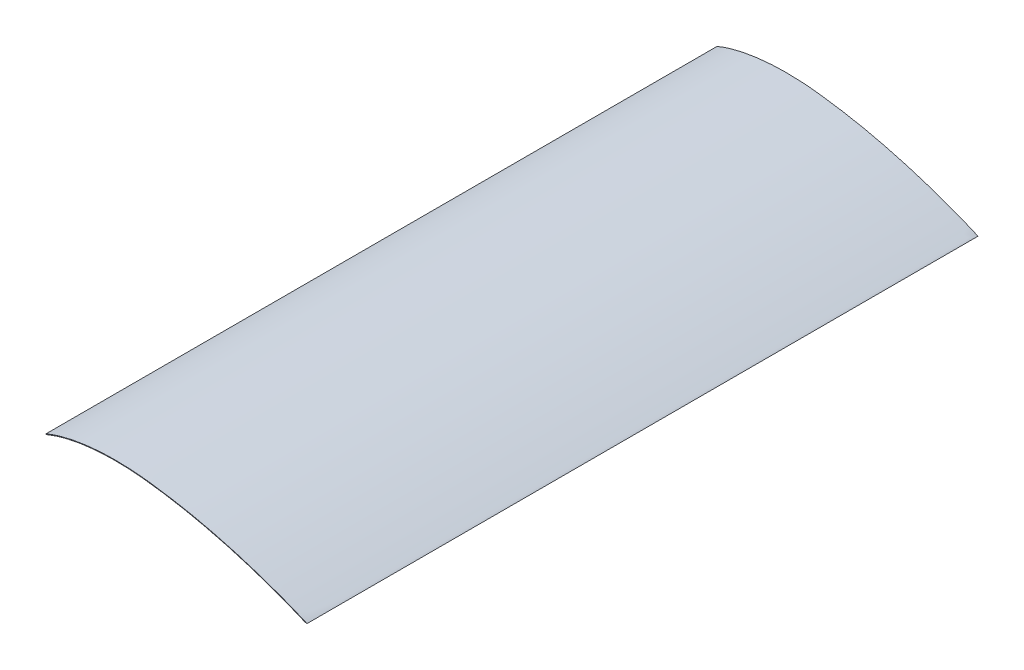
ISO-10303-21;
HEADER;
FILE_DESCRIPTION(('STEP AP214'),'2;1');
FILE_NAME('part.step','',(''),(''),'','','');
FILE_SCHEMA(('AUTOMOTIVE_DESIGN { 1 0 10303 214 1 1 1 1 }'));
ENDSEC;
DATA;
#1=APPLICATION_CONTEXT('core data for automotive mechanical design processes');
#2=APPLICATION_PROTOCOL_DEFINITION('international standard','automotive_design',2000,#1);
#3=PRODUCT_CONTEXT('',#1,'mechanical');
#4=PRODUCT('Part','Part','',(#3));
#5=PRODUCT_RELATED_PRODUCT_CATEGORY('part','',(#4));
#6=PRODUCT_DEFINITION_FORMATION('','',#4);
#7=PRODUCT_DEFINITION_CONTEXT('part definition',#1,'design');
#8=PRODUCT_DEFINITION('design','',#6,#7);
#9=PRODUCT_DEFINITION_SHAPE('','',#8);
#10=(LENGTH_UNIT() NAMED_UNIT(*) SI_UNIT(.MILLI.,.METRE.));
#11=(NAMED_UNIT(*) PLANE_ANGLE_UNIT() SI_UNIT($,.RADIAN.));
#12=(NAMED_UNIT(*) SI_UNIT($,.STERADIAN.) SOLID_ANGLE_UNIT());
#13=UNCERTAINTY_MEASURE_WITH_UNIT(LENGTH_MEASURE(1.E-05),#10,'distance_accuracy_value','');
#14=(GEOMETRIC_REPRESENTATION_CONTEXT(3) GLOBAL_UNCERTAINTY_ASSIGNED_CONTEXT((#13)) GLOBAL_UNIT_ASSIGNED_CONTEXT((#10,
#11,#12)) REPRESENTATION_CONTEXT('',''));
#15=CARTESIAN_POINT('',(0.,0.,0.));
#16=DIRECTION('',(0.,0.,1.));
#17=DIRECTION('',(1.,0.,0.));
#18=AXIS2_PLACEMENT_3D('',#15,#16,#17);
#19=CARTESIAN_POINT('',(2270.77788466961,3159.89663616639,895.35));
#20=CARTESIAN_POINT('',(2270.75441769039,3159.91143855878,895.35));
#21=CARTESIAN_POINT('',(2270.63695656596,3159.96239266981,895.35));
#22=CARTESIAN_POINT('',(2270.36575862843,3160.06926016445,895.35));
#23=CARTESIAN_POINT('',(2269.93906850024,3160.26306640839,895.35));
#24=CARTESIAN_POINT('',(2269.32699403681,3160.50067953595,895.35));
#25=CARTESIAN_POINT('',(2268.57167887371,3160.86200606842,895.35));
#26=CARTESIAN_POINT('',(2267.60940368282,3161.24694817799,895.35));
#27=CARTESIAN_POINT('',(2266.50269764293,3161.75105580007,895.35));
#28=CARTESIAN_POINT('',(2265.19999899403,3162.26377705241,895.35));
#29=CARTESIAN_POINT('',(2263.75825764628,3162.90920339134,895.35));
#30=CARTESIAN_POINT('',(2262.12114844864,3163.56415045029,895.35));
#31=CARTESIAN_POINT('',(2260.33566343513,3164.3301804082,895.35));
#32=CARTESIAN_POINT('',(2258.36407508904,3165.1271879393,895.35));
#33=CARTESIAN_POINT('',(2256.26077350467,3166.03566592802,895.35));
#34=CARTESIAN_POINT('',(2253.96307066851,3166.91249870451,895.35));
#35=CARTESIAN_POINT('',(2251.54387420959,3167.92705758091,895.35));
#36=CARTESIAN_POINT('',(2248.93741357343,3168.93687987265,895.35));
#37=CARTESIAN_POINT('',(2246.1985054601,3170.0895220124,895.35));
#38=CARTESIAN_POINT('',(2243.26627685385,3171.20143110375,895.35));
#39=CARTESIAN_POINT('',(2240.19942848926,3172.37679779784,895.35));
#40=CARTESIAN_POINT('',(2237.00258241217,3173.63067668475,895.35));
#41=CARTESIAN_POINT('',(2233.62513923245,3174.83803358942,895.35));
#42=CARTESIAN_POINT('',(2230.13801904045,3176.1781322585,895.35));
#43=CARTESIAN_POINT('',(2226.50130882034,3177.51113996912,895.35));
#44=CARTESIAN_POINT('',(2222.72308913832,3178.84660029749,895.35));
#45=CARTESIAN_POINT('',(2218.80429741313,3180.23256580446,895.35));
#46=CARTESIAN_POINT('',(2214.76588339932,3181.68446522613,895.35));
#47=CARTESIAN_POINT('',(2210.57362780371,3183.06607239162,895.35));
#48=CARTESIAN_POINT('',(2206.28683514806,3184.54064589503,895.35));
#49=CARTESIAN_POINT('',(2201.86217341549,3185.99073749897,895.35));
#50=CARTESIAN_POINT('',(2197.3190000198,3187.46365163279,895.35));
#51=CARTESIAN_POINT('',(2192.67416270832,3188.93408962667,895.35));
#52=CARTESIAN_POINT('',(2187.9232086531,3190.42759829958,895.35));
#53=CARTESIAN_POINT('',(2183.07356064678,3191.91931943375,895.35));
#54=CARTESIAN_POINT('',(2178.10228087778,3193.37336943061,895.35));
#55=CARTESIAN_POINT('',(2173.05533437455,3194.85114325785,895.35));
#56=CARTESIAN_POINT('',(2167.90821903263,3196.27713073043,895.35));
#57=CARTESIAN_POINT('',(2162.6816005395,3197.72333555087,895.35));
#58=CARTESIAN_POINT('',(2157.38815239052,3199.18447750399,895.35));
#59=CARTESIAN_POINT('',(2151.9869454316,3200.55249360316,895.35));
#60=CARTESIAN_POINT('',(2146.53036986134,3201.92921093909,895.35));
#61=CARTESIAN_POINT('',(2141.02366012594,3203.33994756066,895.35));
#62=CARTESIAN_POINT('',(2135.44750632117,3204.64652814106,895.35));
#63=CARTESIAN_POINT('',(2129.82565461853,3205.93588774425,895.35));
#64=CARTESIAN_POINT('',(2124.13403374766,3207.17561141733,895.35));
#65=CARTESIAN_POINT('',(2118.41784400398,3208.45051225556,895.35));
#66=CARTESIAN_POINT('',(2112.64631541419,3209.61725546409,895.35));
#67=CARTESIAN_POINT('',(2106.85842089775,3210.78690702624,895.35));
#68=CARTESIAN_POINT('',(2101.02628741808,3211.83151467106,895.35));
#69=CARTESIAN_POINT('',(2095.19814673357,3212.93341937269,895.35));
#70=CARTESIAN_POINT('',(2089.34512567525,3213.94163165049,895.35));
#71=CARTESIAN_POINT('',(2083.47919861778,3214.8366070782,895.35));
#72=CARTESIAN_POINT('',(2077.6195211371,3215.81985962215,895.35));
#73=CARTESIAN_POINT('',(2071.74267498587,3216.58384990485,895.35));
#74=CARTESIAN_POINT('',(2065.89798828981,3217.45068756556,895.35));
#75=CARTESIAN_POINT('',(2060.0556024653,3218.12639788215,895.35));
#76=CARTESIAN_POINT('',(2054.21697582898,3218.79916411901,895.35));
#77=CARTESIAN_POINT('',(2048.36498851862,3219.44837693793,895.35));
#78=CARTESIAN_POINT('',(2042.50169237592,3219.96870442143,895.35));
#79=CARTESIAN_POINT('',(2036.65520239213,3220.3646139235,895.35));
#80=CARTESIAN_POINT('',(2030.84198188323,3220.71383907115,895.35));
#81=CARTESIAN_POINT('',(2025.08169778607,3220.91509423003,895.35));
#82=CARTESIAN_POINT('',(2019.37787069975,3221.069638567,895.35));
#83=CARTESIAN_POINT('',(2013.75347819639,3221.0776575298,895.35));
#84=CARTESIAN_POINT('',(2008.18375284768,3221.03353702776,895.35));
#85=CARTESIAN_POINT('',(2002.70721311472,3220.85332481041,895.35));
#86=CARTESIAN_POINT('',(1997.31094032244,3220.59727813217,895.35));
#87=CARTESIAN_POINT('',(1992.00810418627,3220.26082638274,895.35));
#88=CARTESIAN_POINT('',(1986.79786105407,3219.85281768219,895.35));
#89=CARTESIAN_POINT('',(1981.69445283075,3219.35029259485,895.35));
#90=CARTESIAN_POINT('',(1976.70820462213,3218.77364892142,895.35));
#91=CARTESIAN_POINT('',(1971.84426656151,3218.10372937658,895.35));
#92=CARTESIAN_POINT('',(1967.09401103855,3217.40114523239,895.35));
#93=CARTESIAN_POINT('',(1962.47602668157,3216.61531419052,895.35));
#94=CARTESIAN_POINT('',(1957.99501039177,3215.73076672323,895.35));
#95=CARTESIAN_POINT('',(1953.65377870501,3214.81183300925,895.35));
#96=CARTESIAN_POINT('',(1949.45954354017,3213.83847601063,895.35));
#97=CARTESIAN_POINT('',(1945.41779803353,3212.83543872257,895.35));
#98=CARTESIAN_POINT('',(1941.53936577964,3211.73703792526,895.35));
#99=CARTESIAN_POINT('',(1937.7862256577,3210.70181312941,895.35));
#100=CARTESIAN_POINT('',(1934.22427518623,3209.52008651987,895.35));
#101=CARTESIAN_POINT('',(1930.82349313659,3208.33873603158,895.35));
#102=CARTESIAN_POINT('',(1927.57746088316,3207.17536130258,895.35));
#103=CARTESIAN_POINT('',(1924.83244703152,3206.04244597766,895.35));
#104=CARTESIAN_POINT('',(1923.15176930588,3205.34816556829,895.35));
#105=CARTESIAN_POINT('',(1922.49105513807,3205.0669475751,895.35));
#106=B_SPLINE_CURVE_WITH_KNOTS('',3,(#19,#20,#21,#22,#23,#24,#25,#26,#27,#28,#29,#30,#31,#32,
#33,#34,#35,#36,#37,#38,#39,#40,#41,#42,#43,#44,#45,#46,#47,#48,#49,#50,#51,#52,#53,#54,#55,#56,
#57,#58,#59,#60,#61,#62,#63,#64,#65,#66,#67,#68,#69,#70,#71,#72,#73,#74,#75,#76,#77,#78,#79,#80,
#81,#82,#83,#84,#85,#86,#87,#88,#89,#90,#91,#92,#93,#94,#95,#96,#97,#98,#99,#100,#101,#102,#103,
#104,#105),.UNSPECIFIED.,.F.,.F.,(4,1,1,1,1,1,1,1,1,1,1,1,1,1,1,1,1,1,1,1,1,1,1,1,1,1,1,1,1,1,1,
1,1,1,1,1,1,1,1,1,1,1,1,1,1,1,1,1,1,1,1,1,1,1,1,1,1,1,1,1,1,1,1,1,1,1,1,1,1,1,1,1,1,1,1,1,1,1,1,
1,1,1,1,1,4),(0.,0.0032646592471837,0.01530412767345,0.0342841276747175,0.0587581874108095,
0.0929359111498455,0.133105815307578,0.181130717181506,0.236533821787717,0.298407512480774,
0.367661393238582,0.444765429448946,0.527870086358271,0.618824688221263,0.715328368980061,
0.818286840218887,0.928640049506335,1.04544917415071,1.16921377975364,1.29898963112746,
1.43338102519745,1.57476753374715,1.72258126788615,1.87459664737088,2.03222932545561,
2.19587963068012,2.36554771253332,2.53906673166404,2.71719271516992,2.90097302423531,
3.08900152632988,3.28128413604827,3.47640591238317,3.67721297699968,3.88054648038743,
4.08815930176434,4.29832831755882,4.51135827789291,4.72868260050798,4.94689277625484,
5.16941229539971,5.39336887154832,5.61827048648152,5.84582449589453,6.07460234971807,
6.3062689739868,6.53753039316444,6.77005115008798,7.0036739614743,7.23729677285972,
7.47060915830041,7.70510170317167,7.93813983996393,8.1722912516621,8.40498612311402,
8.63596163004119,8.86686791146174,9.09917313568284,9.33135445276082,9.5620344527604,
9.79127305073218,10.0191500078822,10.2427636765157,10.4651634211198,10.6834077841633,
10.9005947460189,11.1122947460183,11.3214623582344,11.528149067048,11.7295285347202,
11.9271092078636,12.1209596048197,12.3094070935271,12.4942513966581,12.6741634473933,
12.8488394972688,13.0183316009194,13.1826967383429,13.340619884207,13.4944196410342,
13.6424495299088,13.7837380078534,13.919674906449,14.0496149064496,14.1344292083141),.UNSPECIFIED.);
#107=DIRECTION('',(0.,0.,-1.));
#108=VECTOR('',#107,1.);
#109=SURFACE_OF_LINEAR_EXTRUSION('',#106,#108);
#110=CARTESIAN_POINT('',(2270.77788466961,3159.89663616639,0.));
#111=CARTESIAN_POINT('',(2270.75441769039,3159.91143855878,0.));
#112=CARTESIAN_POINT('',(2270.63695656596,3159.96239266981,0.));
#113=CARTESIAN_POINT('',(2270.36575862843,3160.06926016445,0.));
#114=CARTESIAN_POINT('',(2269.93906850024,3160.26306640839,0.));
#115=CARTESIAN_POINT('',(2269.32699403681,3160.50067953595,0.));
#116=CARTESIAN_POINT('',(2268.57167887371,3160.86200606842,0.));
#117=CARTESIAN_POINT('',(2267.60940368282,3161.24694817799,0.));
#118=CARTESIAN_POINT('',(2266.50269764293,3161.75105580007,0.));
#119=CARTESIAN_POINT('',(2265.19999899403,3162.26377705241,0.));
#120=CARTESIAN_POINT('',(2263.75825764628,3162.90920339134,0.));
#121=CARTESIAN_POINT('',(2262.12114844864,3163.56415045029,0.));
#122=CARTESIAN_POINT('',(2260.33566343513,3164.3301804082,0.));
#123=CARTESIAN_POINT('',(2258.36407508904,3165.1271879393,0.));
#124=CARTESIAN_POINT('',(2256.26077350467,3166.03566592802,0.));
#125=CARTESIAN_POINT('',(2253.96307066851,3166.91249870451,0.));
#126=CARTESIAN_POINT('',(2251.54387420959,3167.92705758091,0.));
#127=CARTESIAN_POINT('',(2248.93741357343,3168.93687987265,0.));
#128=CARTESIAN_POINT('',(2246.1985054601,3170.0895220124,0.));
#129=CARTESIAN_POINT('',(2243.26627685385,3171.20143110375,0.));
#130=CARTESIAN_POINT('',(2240.19942848926,3172.37679779784,0.));
#131=CARTESIAN_POINT('',(2237.00258241217,3173.63067668475,0.));
#132=CARTESIAN_POINT('',(2233.62513923245,3174.83803358942,0.));
#133=CARTESIAN_POINT('',(2230.13801904045,3176.1781322585,0.));
#134=CARTESIAN_POINT('',(2226.50130882034,3177.51113996912,0.));
#135=CARTESIAN_POINT('',(2222.72308913832,3178.84660029749,0.));
#136=CARTESIAN_POINT('',(2218.80429741313,3180.23256580446,0.));
#137=CARTESIAN_POINT('',(2214.76588339932,3181.68446522613,0.));
#138=CARTESIAN_POINT('',(2210.57362780371,3183.06607239162,0.));
#139=CARTESIAN_POINT('',(2206.28683514806,3184.54064589503,0.));
#140=CARTESIAN_POINT('',(2201.86217341549,3185.99073749897,0.));
#141=CARTESIAN_POINT('',(2197.3190000198,3187.46365163279,0.));
#142=CARTESIAN_POINT('',(2192.67416270832,3188.93408962667,0.));
#143=CARTESIAN_POINT('',(2187.9232086531,3190.42759829958,0.));
#144=CARTESIAN_POINT('',(2183.07356064678,3191.91931943375,0.));
#145=CARTESIAN_POINT('',(2178.10228087778,3193.37336943061,0.));
#146=CARTESIAN_POINT('',(2173.05533437455,3194.85114325785,0.));
#147=CARTESIAN_POINT('',(2167.90821903263,3196.27713073043,0.));
#148=CARTESIAN_POINT('',(2162.6816005395,3197.72333555087,0.));
#149=CARTESIAN_POINT('',(2157.38815239052,3199.18447750399,0.));
#150=CARTESIAN_POINT('',(2151.9869454316,3200.55249360316,0.));
#151=CARTESIAN_POINT('',(2146.53036986134,3201.92921093909,0.));
#152=CARTESIAN_POINT('',(2141.02366012594,3203.33994756066,0.));
#153=CARTESIAN_POINT('',(2135.44750632117,3204.64652814106,0.));
#154=CARTESIAN_POINT('',(2129.82565461853,3205.93588774425,0.));
#155=CARTESIAN_POINT('',(2124.13403374766,3207.17561141733,0.));
#156=CARTESIAN_POINT('',(2118.41784400398,3208.45051225556,0.));
#157=CARTESIAN_POINT('',(2112.64631541419,3209.61725546409,0.));
#158=CARTESIAN_POINT('',(2106.85842089775,3210.78690702624,0.));
#159=CARTESIAN_POINT('',(2101.02628741808,3211.83151467106,0.));
#160=CARTESIAN_POINT('',(2095.19814673357,3212.93341937269,0.));
#161=CARTESIAN_POINT('',(2089.34512567525,3213.94163165049,0.));
#162=CARTESIAN_POINT('',(2083.47919861778,3214.8366070782,0.));
#163=CARTESIAN_POINT('',(2077.6195211371,3215.81985962215,0.));
#164=CARTESIAN_POINT('',(2071.74267498587,3216.58384990485,0.));
#165=CARTESIAN_POINT('',(2065.89798828981,3217.45068756556,0.));
#166=CARTESIAN_POINT('',(2060.0556024653,3218.12639788215,0.));
#167=CARTESIAN_POINT('',(2054.21697582898,3218.79916411901,0.));
#168=CARTESIAN_POINT('',(2048.36498851862,3219.44837693793,0.));
#169=CARTESIAN_POINT('',(2042.50169237592,3219.96870442143,0.));
#170=CARTESIAN_POINT('',(2036.65520239213,3220.3646139235,0.));
#171=CARTESIAN_POINT('',(2030.84198188323,3220.71383907115,0.));
#172=CARTESIAN_POINT('',(2025.08169778607,3220.91509423003,0.));
#173=CARTESIAN_POINT('',(2019.37787069975,3221.069638567,0.));
#174=CARTESIAN_POINT('',(2013.75347819639,3221.0776575298,0.));
#175=CARTESIAN_POINT('',(2008.18375284768,3221.03353702776,0.));
#176=CARTESIAN_POINT('',(2002.70721311472,3220.85332481041,0.));
#177=CARTESIAN_POINT('',(1997.31094032244,3220.59727813217,0.));
#178=CARTESIAN_POINT('',(1992.00810418627,3220.26082638274,0.));
#179=CARTESIAN_POINT('',(1986.79786105407,3219.85281768219,0.));
#180=CARTESIAN_POINT('',(1981.69445283075,3219.35029259485,0.));
#181=CARTESIAN_POINT('',(1976.70820462213,3218.77364892142,0.));
#182=CARTESIAN_POINT('',(1971.84426656151,3218.10372937658,0.));
#183=CARTESIAN_POINT('',(1967.09401103855,3217.40114523239,0.));
#184=CARTESIAN_POINT('',(1962.47602668157,3216.61531419052,0.));
#185=CARTESIAN_POINT('',(1957.99501039177,3215.73076672323,0.));
#186=CARTESIAN_POINT('',(1953.65377870501,3214.81183300925,0.));
#187=CARTESIAN_POINT('',(1949.45954354017,3213.83847601063,0.));
#188=CARTESIAN_POINT('',(1945.41779803353,3212.83543872257,0.));
#189=CARTESIAN_POINT('',(1941.53936577964,3211.73703792526,0.));
#190=CARTESIAN_POINT('',(1937.7862256577,3210.70181312941,0.));
#191=CARTESIAN_POINT('',(1934.22427518623,3209.52008651987,0.));
#192=CARTESIAN_POINT('',(1930.82349313659,3208.33873603158,0.));
#193=CARTESIAN_POINT('',(1927.57746088316,3207.17536130258,0.));
#194=CARTESIAN_POINT('',(1924.83244703152,3206.04244597766,0.));
#195=CARTESIAN_POINT('',(1923.15176930588,3205.34816556829,0.));
#196=CARTESIAN_POINT('',(1922.49105513807,3205.0669475751,0.));
#197=B_SPLINE_CURVE_WITH_KNOTS('',3,(#110,#111,#112,#113,#114,#115,#116,#117,#118,#119,#120,
#121,#122,#123,#124,#125,#126,#127,#128,#129,#130,#131,#132,#133,#134,#135,#136,#137,#138,#139,
#140,#141,#142,#143,#144,#145,#146,#147,#148,#149,#150,#151,#152,#153,#154,#155,#156,#157,#158,
#159,#160,#161,#162,#163,#164,#165,#166,#167,#168,#169,#170,#171,#172,#173,#174,#175,#176,#177,
#178,#179,#180,#181,#182,#183,#184,#185,#186,#187,#188,#189,#190,#191,#192,#193,#194,#195,#196),
.UNSPECIFIED.,.F.,.F.,(4,1,1,1,1,1,1,1,1,1,1,1,1,1,1,1,1,1,1,1,1,1,1,1,1,1,1,1,1,1,1,1,1,1,1,1,
1,1,1,1,1,1,1,1,1,1,1,1,1,1,1,1,1,1,1,1,1,1,1,1,1,1,1,1,1,1,1,1,1,1,1,1,1,1,1,1,1,1,1,1,1,1,1,1,
4),(0.,0.0032646592471837,0.01530412767345,0.0342841276747175,0.0587581874108095,
0.0929359111498455,0.133105815307578,0.181130717181506,0.236533821787717,0.298407512480774,
0.367661393238582,0.444765429448946,0.527870086358271,0.618824688221263,0.715328368980061,
0.818286840218887,0.928640049506335,1.04544917415071,1.16921377975364,1.29898963112746,
1.43338102519745,1.57476753374715,1.72258126788615,1.87459664737088,2.03222932545561,
2.19587963068012,2.36554771253332,2.53906673166404,2.71719271516992,2.90097302423531,
3.08900152632988,3.28128413604827,3.47640591238317,3.67721297699968,3.88054648038743,
4.08815930176434,4.29832831755882,4.51135827789291,4.72868260050798,4.94689277625484,
5.16941229539971,5.39336887154832,5.61827048648152,5.84582449589453,6.07460234971807,
6.3062689739868,6.53753039316444,6.77005115008798,7.0036739614743,7.23729677285972,
7.47060915830041,7.70510170317167,7.93813983996393,8.1722912516621,8.40498612311402,
8.63596163004119,8.86686791146174,9.09917313568284,9.33135445276082,9.5620344527604,
9.79127305073218,10.0191500078822,10.2427636765157,10.4651634211198,10.6834077841633,
10.9005947460189,11.1122947460183,11.3214623582344,11.528149067048,11.7295285347202,
11.9271092078636,12.1209596048197,12.3094070935271,12.4942513966581,12.6741634473933,
12.8488394972688,13.0183316009194,13.1826967383429,13.340619884207,13.4944196410342,
13.6424495299088,13.7837380078534,13.919674906449,14.0496149064496,14.1344292083141),.UNSPECIFIED.);
#198=CARTESIAN_POINT('',(2270.77788466961,3159.89663616639,0.));
#199=VERTEX_POINT('',#198);
#200=CARTESIAN_POINT('',(1922.49105513807,3205.0669475751,0.));
#201=VERTEX_POINT('',#200);
#202=EDGE_CURVE('E116',#199,#201,#197,.T.);
#203=ORIENTED_EDGE('',*,*,#202,.T.);
#204=DIRECTION('',(0.,0.,-1.));
#205=VECTOR('',#204,1.);
#206=CARTESIAN_POINT('',(1922.49105513807,3205.0669475751,895.35));
#207=LINE('',#206,#205);
#208=CARTESIAN_POINT('',(1922.49105513807,3205.0669475751,895.35));
#209=VERTEX_POINT('',#208);
#210=EDGE_CURVE('E11',#209,#201,#207,.T.);
#211=ORIENTED_EDGE('',*,*,#210,.F.);
#212=CARTESIAN_POINT('',(2270.77788466961,3159.89663616639,895.35));
#213=VERTEX_POINT('',#212);
#214=EDGE_CURVE('E85',#213,#209,#106,.T.);
#215=ORIENTED_EDGE('',*,*,#214,.F.);
#216=DIRECTION('',(0.,0.,-1.));
#217=VECTOR('',#216,1.);
#218=CARTESIAN_POINT('',(2270.77788466961,3159.89663616639,895.35));
#219=LINE('',#218,#217);
#220=EDGE_CURVE('E93',#213,#199,#219,.T.);
#221=ORIENTED_EDGE('',*,*,#220,.T.);
#222=EDGE_LOOP('',(#203,#211,#215,#221));
#223=FACE_BOUND('',#222,.T.);
#224=ADVANCED_FACE('F33',(#223),#109,.F.);
#225=CARTESIAN_POINT('',(1922.74740443597,3204.34789867021,895.35));
#226=DIRECTION('',(0.941930089567133,0.335809032588542,0.));
#227=DIRECTION('',(-0.335809032588542,0.941930089567134,0.));
#228=AXIS2_PLACEMENT_3D('',#225,#226,#227);
#229=PLANE('',#228);
#230=DIRECTION('',(0.335809032588541,-0.941930089567133,0.));
#231=VECTOR('',#230,1.);
#232=CARTESIAN_POINT('',(1922.74740443597,3204.34789867021,0.));
#233=LINE('',#232,#231);
#234=CARTESIAN_POINT('',(1922.74740443597,3204.34789867021,0.));
#235=VERTEX_POINT('',#234);
#236=EDGE_CURVE('E89',#201,#235,#233,.T.);
#237=ORIENTED_EDGE('',*,*,#236,.T.);
#238=DIRECTION('',(0.,0.,-1.));
#239=VECTOR('',#238,1.);
#240=CARTESIAN_POINT('',(1922.74740443597,3204.34789867021,895.35));
#241=LINE('',#240,#239);
#242=CARTESIAN_POINT('',(1922.74740443597,3204.34789867021,895.35));
#243=VERTEX_POINT('',#242);
#244=EDGE_CURVE('E42',#243,#235,#241,.T.);
#245=ORIENTED_EDGE('',*,*,#244,.F.);
#246=DIRECTION('',(0.335809032588541,-0.941930089567133,0.));
#247=VECTOR('',#246,1.);
#248=CARTESIAN_POINT('',(1922.74740443597,3204.34789867021,895.35));
#249=LINE('',#248,#247);
#250=EDGE_CURVE('E80',#209,#243,#249,.T.);
#251=ORIENTED_EDGE('',*,*,#250,.F.);
#252=ORIENTED_EDGE('',*,*,#210,.T.);
#253=EDGE_LOOP('',(#237,#245,#251,#252));
#254=FACE_BOUND('',#253,.T.);
#255=ADVANCED_FACE('F88',(#254),#229,.F.);
#256=CARTESIAN_POINT('',(1922.74740443597,3204.34789867021,895.35));
#257=CARTESIAN_POINT('',(1922.76142755055,3204.35387263138,895.35));
#258=CARTESIAN_POINT('',(1922.77545166902,3204.35984436324,895.35));
#259=CARTESIAN_POINT('',(1922.78947680174,3204.36581384274,895.35));
#260=CARTESIAN_POINT('',(1935.25078177309,3209.66968554293,895.35));
#261=CARTESIAN_POINT('',(1948.51277321694,3213.19547842295,895.35));
#262=CARTESIAN_POINT('',(1975.62812996429,3218.29374977356,895.35));
#263=CARTESIAN_POINT('',(1989.64096280295,3219.58838668355,895.35));
#264=CARTESIAN_POINT('',(2011.51510680649,3220.40941425025,895.35));
#265=CARTESIAN_POINT('',(2019.38108179599,3220.35144036779,895.35));
#266=CARTESIAN_POINT('',(2031.40997305865,3219.92689681436,895.35));
#267=CARTESIAN_POINT('',(2035.56845350624,3219.67966447782,895.35));
#268=CARTESIAN_POINT('',(2043.88326085843,3219.09841811021,895.35));
#269=CARTESIAN_POINT('',(2048.0247259214,3218.71608153796,895.35));
#270=CARTESIAN_POINT('',(2056.31429327607,3217.79907121438,895.35));
#271=CARTESIAN_POINT('',(2060.47260201703,3217.33768525042,895.35));
#272=CARTESIAN_POINT('',(2068.73049013381,3216.29765353603,895.35));
#273=CARTESIAN_POINT('',(2072.88084872377,3215.70439712157,895.35));
#274=CARTESIAN_POINT('',(2081.92264675269,3214.38631943844,895.35));
#275=CARTESIAN_POINT('',(2086.87239593346,3213.5822866555,895.35));
#276=CARTESIAN_POINT('',(2096.70768544866,3211.90270801771,895.35));
#277=CARTESIAN_POINT('',(2101.63392869052,3210.98109152264,895.35));
#278=CARTESIAN_POINT('',(2111.4319067798,3209.12070044849,895.35));
#279=CARTESIAN_POINT('',(2116.32771914053,3208.11890829679,895.35));
#280=CARTESIAN_POINT('',(2126.08595518637,3205.97338280013,895.35));
#281=CARTESIAN_POINT('',(2130.96944192465,3204.90047404206,895.35));
#282=CARTESIAN_POINT('',(2140.70242378181,3202.63849298783,895.35));
#283=CARTESIAN_POINT('',(2145.53518956096,3201.39607620433,895.35));
#284=CARTESIAN_POINT('',(2155.23123126106,3198.9458280504,895.35));
#285=CARTESIAN_POINT('',(2160.04635936801,3197.66143838263,895.35));
#286=CARTESIAN_POINT('',(2170.74733688029,3194.70117229422,895.35));
#287=CARTESIAN_POINT('',(2176.61722948491,3193.04131502348,895.35));
#288=CARTESIAN_POINT('',(2188.29096907666,3189.55268633085,895.35));
#289=CARTESIAN_POINT('',(2194.10650031851,3187.7037885885,895.35));
#290=CARTESIAN_POINT('',(2205.70948075694,3183.94079454317,895.35));
#291=CARTESIAN_POINT('',(2211.49582518765,3182.03362364386,895.35));
#292=CARTESIAN_POINT('',(2220.05412814327,3178.98232830921,895.35));
#293=CARTESIAN_POINT('',(2222.88339778962,3177.9900122291,895.35));
#294=CARTESIAN_POINT('',(2228.50425658442,3175.97672562794,895.35));
#295=CARTESIAN_POINT('',(2231.28598755319,3174.89767795178,895.35));
#296=CARTESIAN_POINT('',(2236.91692361201,3172.83398234517,895.35));
#297=CARTESIAN_POINT('',(2239.68421999902,3171.75592948607,895.35));
#298=CARTESIAN_POINT('',(2243.83665043833,3170.16966328222,895.35));
#299=CARTESIAN_POINT('',(2245.1841897887,3169.66216658449,895.35));
#300=CARTESIAN_POINT('',(2247.8544296924,3168.57490347158,895.35));
#301=CARTESIAN_POINT('',(2249.21495382874,3168.02036331938,895.35));
#302=CARTESIAN_POINT('',(2251.90088005143,3166.95396154438,895.35));
#303=CARTESIAN_POINT('',(2253.24295032884,3166.38850595483,895.35));
#304=CARTESIAN_POINT('',(2255.94474492841,3165.32864953684,895.35));
#305=CARTESIAN_POINT('',(2257.25858345343,3164.76705188293,895.35));
#306=CARTESIAN_POINT('',(2259.95030030586,3163.65651211391,895.35));
#307=CARTESIAN_POINT('',(2261.28464110519,3163.0903682132,895.35));
#308=CARTESIAN_POINT('',(2263.26395871156,3162.28048295854,895.35));
#309=CARTESIAN_POINT('',(2263.88274667829,3162.01273375383,895.35));
#310=CARTESIAN_POINT('',(2265.1723982797,3161.45650756415,895.35));
#311=CARTESIAN_POINT('',(2265.82363218684,3161.20414019633,895.35));
#312=CARTESIAN_POINT('',(2266.96316849473,3160.70877283607,895.35));
#313=CARTESIAN_POINT('',(2267.51289167172,3160.48362322797,895.35));
#314=CARTESIAN_POINT('',(2268.02520129248,3160.25720943673,895.35));
#315=B_SPLINE_CURVE_WITH_KNOTS('',3,(#256,#257,#258,#259,#260,#261,#262,#263,#264,#265,#266,
#267,#268,#269,#270,#271,#272,#273,#274,#275,#276,#277,#278,#279,#280,#281,#282,#283,#284,#285,
#286,#287,#288,#289,#290,#291,#292,#293,#294,#295,#296,#297,#298,#299,#300,#301,#302,#303,#304,
#305,#306,#307,#308,#309,#310,#311,#312,#313,#314),.UNSPECIFIED.,.F.,.F.,(4,3,2,2,2,2,2,2,2,2,2,
2,2,2,2,2,2,2,2,2,2,2,2,2,2,2,2,2,4),(0.105061788045519,0.106875839718325,1.71865745864588,
3.3787226380785,4.30985279954415,4.80302578647533,5.29619877340652,5.7893717603377,
6.28254474726889,6.87312366553003,7.46370258379118,8.05428150205232,8.64486042031347,
9.23543933857462,9.82601825683576,10.5468980065001,11.2677777561645,11.9886575058288,
12.3419136578318,12.6951698098347,13.0484259618377,13.2196473061167,13.3908686503958,
13.5620899946748,13.7333113389538,13.9045326832329,13.9865590255693,14.0685853679057,
14.1362432599869),.UNSPECIFIED.);
#316=DIRECTION('',(0.,0.,-1.));
#317=VECTOR('',#316,1.);
#318=SURFACE_OF_LINEAR_EXTRUSION('',#315,#317);
#319=CARTESIAN_POINT('',(1922.74740443597,3204.34789867021,0.));
#320=CARTESIAN_POINT('',(1922.76142755055,3204.35387263138,0.));
#321=CARTESIAN_POINT('',(1922.77545166902,3204.35984436324,0.));
#322=CARTESIAN_POINT('',(1922.78947680174,3204.36581384274,0.));
#323=CARTESIAN_POINT('',(1935.25078177309,3209.66968554293,0.));
#324=CARTESIAN_POINT('',(1948.51277321694,3213.19547842295,0.));
#325=CARTESIAN_POINT('',(1975.62812996429,3218.29374977356,0.));
#326=CARTESIAN_POINT('',(1989.64096280295,3219.58838668355,0.));
#327=CARTESIAN_POINT('',(2011.51510680649,3220.40941425025,0.));
#328=CARTESIAN_POINT('',(2019.38108179599,3220.35144036779,0.));
#329=CARTESIAN_POINT('',(2031.40997305865,3219.92689681436,0.));
#330=CARTESIAN_POINT('',(2035.56845350624,3219.67966447782,0.));
#331=CARTESIAN_POINT('',(2043.88326085843,3219.09841811021,0.));
#332=CARTESIAN_POINT('',(2048.0247259214,3218.71608153796,0.));
#333=CARTESIAN_POINT('',(2056.31429327607,3217.79907121438,0.));
#334=CARTESIAN_POINT('',(2060.47260201703,3217.33768525042,0.));
#335=CARTESIAN_POINT('',(2068.73049013381,3216.29765353603,0.));
#336=CARTESIAN_POINT('',(2072.88084872377,3215.70439712157,0.));
#337=CARTESIAN_POINT('',(2081.92264675269,3214.38631943844,0.));
#338=CARTESIAN_POINT('',(2086.87239593346,3213.5822866555,0.));
#339=CARTESIAN_POINT('',(2096.70768544866,3211.90270801771,0.));
#340=CARTESIAN_POINT('',(2101.63392869052,3210.98109152264,0.));
#341=CARTESIAN_POINT('',(2111.4319067798,3209.12070044849,0.));
#342=CARTESIAN_POINT('',(2116.32771914053,3208.11890829679,0.));
#343=CARTESIAN_POINT('',(2126.08595518637,3205.97338280013,0.));
#344=CARTESIAN_POINT('',(2130.96944192465,3204.90047404206,0.));
#345=CARTESIAN_POINT('',(2140.70242378181,3202.63849298783,0.));
#346=CARTESIAN_POINT('',(2145.53518956096,3201.39607620433,0.));
#347=CARTESIAN_POINT('',(2155.23123126106,3198.9458280504,0.));
#348=CARTESIAN_POINT('',(2160.04635936801,3197.66143838263,0.));
#349=CARTESIAN_POINT('',(2170.74733688029,3194.70117229422,0.));
#350=CARTESIAN_POINT('',(2176.61722948491,3193.04131502348,0.));
#351=CARTESIAN_POINT('',(2188.29096907666,3189.55268633085,0.));
#352=CARTESIAN_POINT('',(2194.10650031851,3187.7037885885,0.));
#353=CARTESIAN_POINT('',(2205.70948075694,3183.94079454317,0.));
#354=CARTESIAN_POINT('',(2211.49582518765,3182.03362364386,0.));
#355=CARTESIAN_POINT('',(2220.05412814327,3178.98232830921,0.));
#356=CARTESIAN_POINT('',(2222.88339778962,3177.9900122291,0.));
#357=CARTESIAN_POINT('',(2228.50425658442,3175.97672562794,0.));
#358=CARTESIAN_POINT('',(2231.28598755319,3174.89767795178,0.));
#359=CARTESIAN_POINT('',(2236.91692361201,3172.83398234517,0.));
#360=CARTESIAN_POINT('',(2239.68421999902,3171.75592948607,0.));
#361=CARTESIAN_POINT('',(2243.83665043833,3170.16966328222,0.));
#362=CARTESIAN_POINT('',(2245.1841897887,3169.66216658449,0.));
#363=CARTESIAN_POINT('',(2247.8544296924,3168.57490347158,0.));
#364=CARTESIAN_POINT('',(2249.21495382874,3168.02036331938,0.));
#365=CARTESIAN_POINT('',(2251.90088005143,3166.95396154438,0.));
#366=CARTESIAN_POINT('',(2253.24295032884,3166.38850595483,0.));
#367=CARTESIAN_POINT('',(2255.94474492841,3165.32864953684,0.));
#368=CARTESIAN_POINT('',(2257.25858345343,3164.76705188293,0.));
#369=CARTESIAN_POINT('',(2259.95030030586,3163.65651211391,0.));
#370=CARTESIAN_POINT('',(2261.28464110519,3163.0903682132,0.));
#371=CARTESIAN_POINT('',(2263.26395871156,3162.28048295854,0.));
#372=CARTESIAN_POINT('',(2263.88274667829,3162.01273375383,0.));
#373=CARTESIAN_POINT('',(2265.1723982797,3161.45650756415,0.));
#374=CARTESIAN_POINT('',(2265.82363218684,3161.20414019633,0.));
#375=CARTESIAN_POINT('',(2266.96316849473,3160.70877283607,0.));
#376=CARTESIAN_POINT('',(2267.51289167172,3160.48362322797,0.));
#377=CARTESIAN_POINT('',(2268.02520129248,3160.25720943673,0.));
#378=B_SPLINE_CURVE_WITH_KNOTS('',3,(#319,#320,#321,#322,#323,#324,#325,#326,#327,#328,#329,
#330,#331,#332,#333,#334,#335,#336,#337,#338,#339,#340,#341,#342,#343,#344,#345,#346,#347,#348,
#349,#350,#351,#352,#353,#354,#355,#356,#357,#358,#359,#360,#361,#362,#363,#364,#365,#366,#367,
#368,#369,#370,#371,#372,#373,#374,#375,#376,#377),.UNSPECIFIED.,.F.,.F.,(4,3,2,2,2,2,2,2,2,2,2,
2,2,2,2,2,2,2,2,2,2,2,2,2,2,2,2,2,4),(0.105061788045519,0.106875839718325,1.71865745864588,
3.3787226380785,4.30985279954415,4.80302578647533,5.29619877340652,5.7893717603377,
6.28254474726889,6.87312366553003,7.46370258379118,8.05428150205232,8.64486042031347,
9.23543933857462,9.82601825683576,10.5468980065001,11.2677777561645,11.9886575058288,
12.3419136578318,12.6951698098347,13.0484259618377,13.2196473061167,13.3908686503958,
13.5620899946748,13.7333113389538,13.9045326832329,13.9865590255693,14.0685853679057,
14.1362432599869),.UNSPECIFIED.);
#379=CARTESIAN_POINT('',(2268.02520129248,3160.25720943673,0.));
#380=VERTEX_POINT('',#379);
#381=EDGE_CURVE('E67',#235,#380,#378,.T.);
#382=ORIENTED_EDGE('',*,*,#381,.T.);
#383=DIRECTION('',(0.,0.,-1.));
#384=VECTOR('',#383,1.);
#385=CARTESIAN_POINT('',(2268.02520129248,3160.25720943673,895.35));
#386=LINE('',#385,#384);
#387=CARTESIAN_POINT('',(2268.02520129248,3160.25720943673,895.35));
#388=VERTEX_POINT('',#387);
#389=EDGE_CURVE('E90',#388,#380,#386,.T.);
#390=ORIENTED_EDGE('',*,*,#389,.F.);
#391=EDGE_CURVE('E83',#243,#388,#315,.T.);
#392=ORIENTED_EDGE('',*,*,#391,.F.);
#393=ORIENTED_EDGE('',*,*,#244,.T.);
#394=EDGE_LOOP('',(#382,#390,#392,#393));
#395=FACE_BOUND('',#394,.T.);
#396=ADVANCED_FACE('F91',(#395),#318,.F.);
#397=CARTESIAN_POINT('',(2268.02520129248,3160.25720943673,895.35));
#398=DIRECTION('',(0.129880213129611,0.991529692060408,0.));
#399=DIRECTION('',(-0.991529692060408,0.129880213129611,0.));
#400=AXIS2_PLACEMENT_3D('',#397,#398,#399);
#401=PLANE('',#400);
#402=DIRECTION('',(0.991529692060408,-0.129880213129611,0.));
#403=VECTOR('',#402,1.);
#404=CARTESIAN_POINT('',(2268.02520129248,3160.25720943673,0.));
#405=LINE('',#404,#403);
#406=EDGE_CURVE('E73',#380,#199,#405,.T.);
#407=ORIENTED_EDGE('',*,*,#406,.T.);
#408=ORIENTED_EDGE('',*,*,#220,.F.);
#409=DIRECTION('',(0.991529692060408,-0.129880213129611,0.));
#410=VECTOR('',#409,1.);
#411=CARTESIAN_POINT('',(2268.02520129248,3160.25720943673,895.35));
#412=LINE('',#411,#410);
#413=EDGE_CURVE('E50',#388,#213,#412,.T.);
#414=ORIENTED_EDGE('',*,*,#413,.F.);
#415=ORIENTED_EDGE('',*,*,#389,.T.);
#416=EDGE_LOOP('',(#407,#408,#414,#415));
#417=FACE_BOUND('',#416,.T.);
#418=ADVANCED_FACE('F105',(#417),#401,.F.);
#419=CARTESIAN_POINT('',(2099.44107177825,3212.13463475757,895.35));
#420=DIRECTION('',(0.,0.,-1.));
#421=DIRECTION('',(-1.,0.,0.));
#422=AXIS2_PLACEMENT_3D('',#419,#420,#421);
#423=PLANE('',#422);
#424=ORIENTED_EDGE('',*,*,#214,.T.);
#425=ORIENTED_EDGE('',*,*,#250,.T.);
#426=ORIENTED_EDGE('',*,*,#391,.T.);
#427=ORIENTED_EDGE('',*,*,#413,.T.);
#428=EDGE_LOOP('',(#424,#425,#426,#427));
#429=FACE_BOUND('',#428,.T.);
#430=ADVANCED_FACE('F81',(#429),#423,.F.);
#431=CARTESIAN_POINT('',(2099.44107177825,3212.13463475757,0.));
#432=DIRECTION('',(0.,0.,-1.));
#433=DIRECTION('',(-1.,0.,0.));
#434=AXIS2_PLACEMENT_3D('',#431,#432,#433);
#435=PLANE('',#434);
#436=ORIENTED_EDGE('',*,*,#202,.F.);
#437=ORIENTED_EDGE('',*,*,#406,.F.);
#438=ORIENTED_EDGE('',*,*,#381,.F.);
#439=ORIENTED_EDGE('',*,*,#236,.F.);
#440=EDGE_LOOP('',(#436,#437,#438,#439));
#441=FACE_BOUND('',#440,.T.);
#442=ADVANCED_FACE('F133',(#441),#435,.T.);
#443=CLOSED_SHELL('',(#224,#255,#396,#418,#430,#442));
#444=MANIFOLD_SOLID_BREP('B2',#443);
#445=ADVANCED_BREP_SHAPE_REPRESENTATION('',(#18,#444),#14);
#446=SHAPE_DEFINITION_REPRESENTATION(#9,#445);
ENDSEC;
END-ISO-10303-21;
